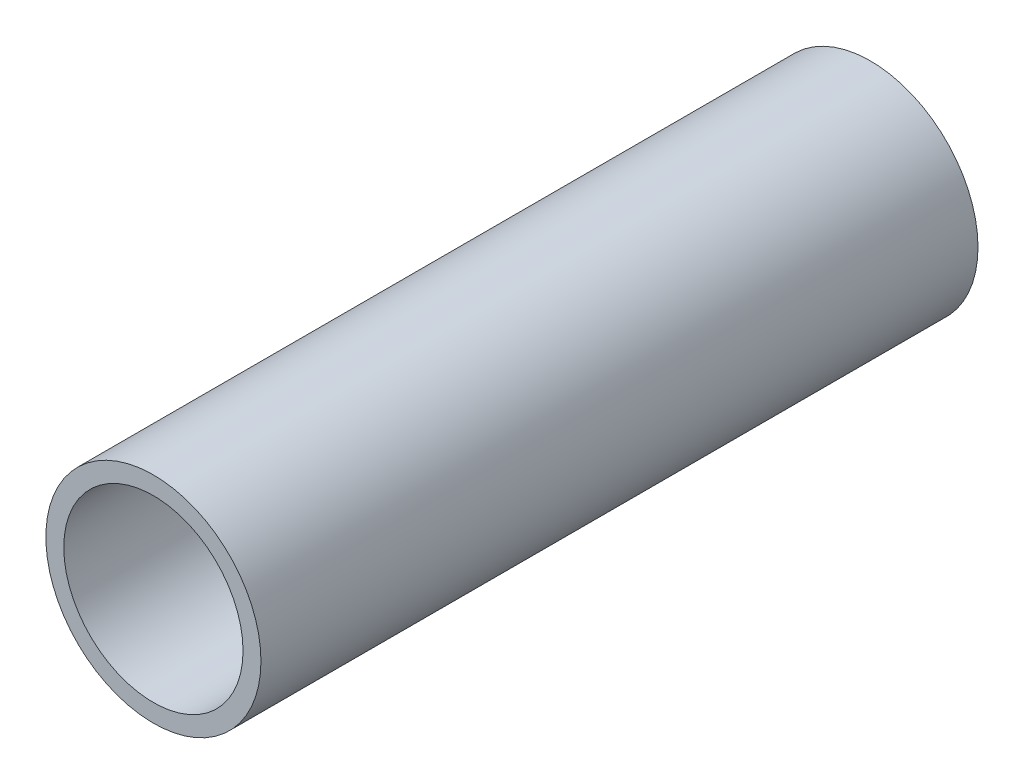
ISO-10303-21;
HEADER;
FILE_DESCRIPTION(('STEP AP214'),'2;1');
FILE_NAME('part.step','',(''),(''),'','','');
FILE_SCHEMA(('AUTOMOTIVE_DESIGN { 1 0 10303 214 1 1 1 1 }'));
ENDSEC;
DATA;
#1=APPLICATION_CONTEXT('core data for automotive mechanical design processes');
#2=APPLICATION_PROTOCOL_DEFINITION('international standard','automotive_design',2000,#1);
#3=PRODUCT_CONTEXT('',#1,'mechanical');
#4=PRODUCT('Part','Part','',(#3));
#5=PRODUCT_RELATED_PRODUCT_CATEGORY('part','',(#4));
#6=PRODUCT_DEFINITION_FORMATION('','',#4);
#7=PRODUCT_DEFINITION_CONTEXT('part definition',#1,'design');
#8=PRODUCT_DEFINITION('design','',#6,#7);
#9=PRODUCT_DEFINITION_SHAPE('','',#8);
#10=(LENGTH_UNIT() NAMED_UNIT(*) SI_UNIT(.MILLI.,.METRE.));
#11=(NAMED_UNIT(*) PLANE_ANGLE_UNIT() SI_UNIT($,.RADIAN.));
#12=(NAMED_UNIT(*) SI_UNIT($,.STERADIAN.) SOLID_ANGLE_UNIT());
#13=UNCERTAINTY_MEASURE_WITH_UNIT(LENGTH_MEASURE(1.E-05),#10,'distance_accuracy_value','');
#14=(GEOMETRIC_REPRESENTATION_CONTEXT(3) GLOBAL_UNCERTAINTY_ASSIGNED_CONTEXT((#13)) GLOBAL_UNIT_ASSIGNED_CONTEXT((#10,
#11,#12)) REPRESENTATION_CONTEXT('',''));
#15=CARTESIAN_POINT('',(0.,0.,0.));
#16=DIRECTION('',(0.,0.,1.));
#17=DIRECTION('',(1.,0.,0.));
#18=AXIS2_PLACEMENT_3D('',#15,#16,#17);
#19=CARTESIAN_POINT('',(0.,0.,40.));
#20=DIRECTION('',(0.,0.,1.));
#21=DIRECTION('',(1.,0.,0.));
#22=AXIS2_PLACEMENT_3D('',#19,#20,#21);
#23=PLANE('',#22);
#24=CARTESIAN_POINT('',(0.,0.,40.));
#25=DIRECTION('',(0.,0.,1.));
#26=DIRECTION('',(1.,0.,0.));
#27=AXIS2_PLACEMENT_3D('',#24,#25,#26);
#28=CIRCLE('',#27,6.);
#29=CARTESIAN_POINT('',(6.,0.,40.));
#30=VERTEX_POINT('',#29);
#31=EDGE_CURVE('E10',#30,#30,#28,.T.);
#32=ORIENTED_EDGE('',*,*,#31,.T.);
#33=EDGE_LOOP('',(#32));
#34=FACE_BOUND('',#33,.T.);
#35=CARTESIAN_POINT('',(0.,0.,40.));
#36=DIRECTION('',(0.,0.,1.));
#37=DIRECTION('',(1.,0.,0.));
#38=AXIS2_PLACEMENT_3D('',#35,#36,#37);
#39=CIRCLE('',#38,5.);
#40=CARTESIAN_POINT('',(5.,0.,40.));
#41=VERTEX_POINT('',#40);
#42=EDGE_CURVE('E41',#41,#41,#39,.T.);
#43=ORIENTED_EDGE('',*,*,#42,.F.);
#44=EDGE_LOOP('',(#43));
#45=FACE_BOUND('',#44,.T.);
#46=ADVANCED_FACE('F30',(#34,#45),#23,.T.);
#47=CARTESIAN_POINT('',(0.,0.,0.));
#48=DIRECTION('',(0.,0.,1.));
#49=DIRECTION('',(1.,0.,0.));
#50=AXIS2_PLACEMENT_3D('',#47,#48,#49);
#51=PLANE('',#50);
#52=CARTESIAN_POINT('',(0.,0.,0.));
#53=DIRECTION('',(0.,0.,1.));
#54=DIRECTION('',(1.,0.,0.));
#55=AXIS2_PLACEMENT_3D('',#52,#53,#54);
#56=CIRCLE('',#55,6.);
#57=CARTESIAN_POINT('',(6.,0.,0.));
#58=VERTEX_POINT('',#57);
#59=EDGE_CURVE('E34',#58,#58,#56,.T.);
#60=ORIENTED_EDGE('',*,*,#59,.F.);
#61=EDGE_LOOP('',(#60));
#62=FACE_BOUND('',#61,.T.);
#63=CARTESIAN_POINT('',(0.,0.,0.));
#64=DIRECTION('',(0.,0.,1.));
#65=DIRECTION('',(1.,0.,0.));
#66=AXIS2_PLACEMENT_3D('',#63,#64,#65);
#67=CIRCLE('',#66,5.);
#68=CARTESIAN_POINT('',(5.,0.,0.));
#69=VERTEX_POINT('',#68);
#70=EDGE_CURVE('E43',#69,#69,#67,.T.);
#71=ORIENTED_EDGE('',*,*,#70,.T.);
#72=EDGE_LOOP('',(#71));
#73=FACE_BOUND('',#72,.T.);
#74=ADVANCED_FACE('F53',(#62,#73),#51,.F.);
#75=CARTESIAN_POINT('',(0.,0.,40.));
#76=DIRECTION('',(0.,0.,-1.));
#77=DIRECTION('',(-1.,0.,0.));
#78=AXIS2_PLACEMENT_3D('',#75,#76,#77);
#79=CYLINDRICAL_SURFACE('',#78,6.);
#80=ORIENTED_EDGE('',*,*,#31,.F.);
#81=EDGE_LOOP('',(#80));
#82=FACE_BOUND('',#81,.T.);
#83=ORIENTED_EDGE('',*,*,#59,.T.);
#84=EDGE_LOOP('',(#83));
#85=FACE_BOUND('',#84,.T.);
#86=ADVANCED_FACE('F32',(#82,#85),#79,.T.);
#87=CARTESIAN_POINT('',(0.,0.,40.));
#88=DIRECTION('',(0.,0.,-1.));
#89=DIRECTION('',(-1.,0.,0.));
#90=AXIS2_PLACEMENT_3D('',#87,#88,#89);
#91=CYLINDRICAL_SURFACE('',#90,5.);
#92=ORIENTED_EDGE('',*,*,#42,.T.);
#93=EDGE_LOOP('',(#92));
#94=FACE_BOUND('',#93,.T.);
#95=ORIENTED_EDGE('',*,*,#70,.F.);
#96=EDGE_LOOP('',(#95));
#97=FACE_BOUND('',#96,.T.);
#98=ADVANCED_FACE('F49',(#94,#97),#91,.F.);
#99=CLOSED_SHELL('',(#46,#74,#86,#98));
#100=MANIFOLD_SOLID_BREP('B2',#99);
#101=ADVANCED_BREP_SHAPE_REPRESENTATION('',(#18,#100),#14);
#102=SHAPE_DEFINITION_REPRESENTATION(#9,#101);
ENDSEC;
END-ISO-10303-21;
